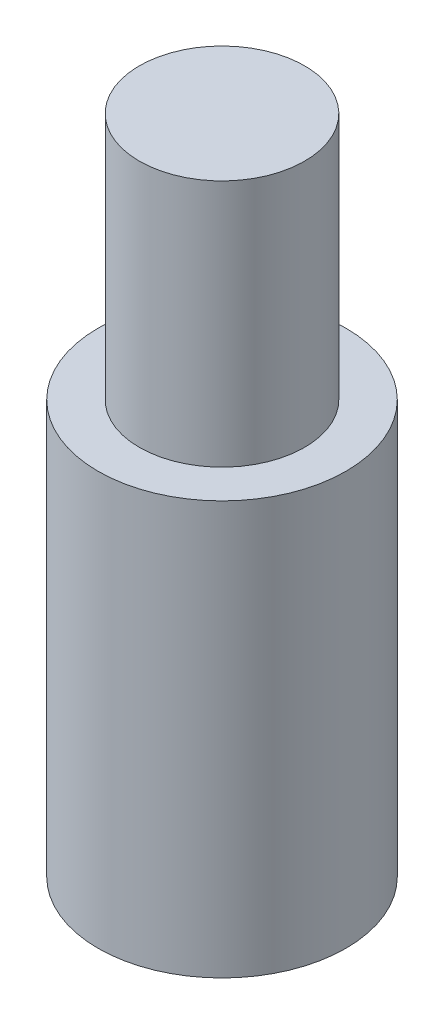
ISO-10303-21;
HEADER;
FILE_DESCRIPTION(('STEP AP214'),'2;1');
FILE_NAME('part.step','',(''),(''),'','','');
FILE_SCHEMA(('AUTOMOTIVE_DESIGN { 1 0 10303 214 1 1 1 1 }'));
ENDSEC;
DATA;
#1=APPLICATION_CONTEXT('core data for automotive mechanical design processes');
#2=APPLICATION_PROTOCOL_DEFINITION('international standard','automotive_design',2000,#1);
#3=PRODUCT_CONTEXT('',#1,'mechanical');
#4=PRODUCT('Part','Part','',(#3));
#5=PRODUCT_RELATED_PRODUCT_CATEGORY('part','',(#4));
#6=PRODUCT_DEFINITION_FORMATION('','',#4);
#7=PRODUCT_DEFINITION_CONTEXT('part definition',#1,'design');
#8=PRODUCT_DEFINITION('design','',#6,#7);
#9=PRODUCT_DEFINITION_SHAPE('','',#8);
#10=(LENGTH_UNIT() NAMED_UNIT(*) SI_UNIT(.MILLI.,.METRE.));
#11=(NAMED_UNIT(*) PLANE_ANGLE_UNIT() SI_UNIT($,.RADIAN.));
#12=(NAMED_UNIT(*) SI_UNIT($,.STERADIAN.) SOLID_ANGLE_UNIT());
#13=UNCERTAINTY_MEASURE_WITH_UNIT(LENGTH_MEASURE(1.E-05),#10,'distance_accuracy_value','');
#14=(GEOMETRIC_REPRESENTATION_CONTEXT(3) GLOBAL_UNCERTAINTY_ASSIGNED_CONTEXT((#13)) GLOBAL_UNIT_ASSIGNED_CONTEXT((#10,
#11,#12)) REPRESENTATION_CONTEXT('',''));
#15=CARTESIAN_POINT('',(0.,0.,0.));
#16=DIRECTION('',(0.,0.,1.));
#17=DIRECTION('',(1.,0.,0.));
#18=AXIS2_PLACEMENT_3D('',#15,#16,#17);
#19=CARTESIAN_POINT('',(0.,50.,0.));
#20=DIRECTION('',(0.,-1.,0.));
#21=DIRECTION('',(0.,0.,-1.));
#22=AXIS2_PLACEMENT_3D('',#19,#20,#21);
#23=CYLINDRICAL_SURFACE('',#22,15.);
#24=CARTESIAN_POINT('',(0.,50.,0.));
#25=DIRECTION('',(0.,1.,0.));
#26=DIRECTION('',(0.,0.,1.));
#27=AXIS2_PLACEMENT_3D('',#24,#25,#26);
#28=CIRCLE('',#27,15.);
#29=CARTESIAN_POINT('',(0.,50.,15.));
#30=VERTEX_POINT('',#29);
#31=EDGE_CURVE('E59',#30,#30,#28,.T.);
#32=ORIENTED_EDGE('',*,*,#31,.F.);
#33=EDGE_LOOP('',(#32));
#34=FACE_BOUND('',#33,.T.);
#35=CARTESIAN_POINT('',(0.,0.,0.));
#36=DIRECTION('',(0.,1.,0.));
#37=DIRECTION('',(0.,0.,1.));
#38=AXIS2_PLACEMENT_3D('',#35,#36,#37);
#39=CIRCLE('',#38,15.);
#40=CARTESIAN_POINT('',(0.,0.,15.));
#41=VERTEX_POINT('',#40);
#42=EDGE_CURVE('E53',#41,#41,#39,.T.);
#43=ORIENTED_EDGE('',*,*,#42,.T.);
#44=EDGE_LOOP('',(#43));
#45=FACE_BOUND('',#44,.T.);
#46=ADVANCED_FACE('F50',(#34,#45),#23,.T.);
#47=CARTESIAN_POINT('',(0.,50.,0.));
#48=DIRECTION('',(0.,1.,0.));
#49=DIRECTION('',(0.,0.,1.));
#50=AXIS2_PLACEMENT_3D('',#47,#48,#49);
#51=PLANE('',#50);
#52=CARTESIAN_POINT('',(0.,50.,0.));
#53=DIRECTION('',(0.,1.,0.));
#54=DIRECTION('',(0.,0.,1.));
#55=AXIS2_PLACEMENT_3D('',#52,#53,#54);
#56=CIRCLE('',#55,10.);
#57=CARTESIAN_POINT('',(0.,50.,10.));
#58=VERTEX_POINT('',#57);
#59=EDGE_CURVE('E11',#58,#58,#56,.T.);
#60=ORIENTED_EDGE('',*,*,#59,.F.);
#61=EDGE_LOOP('',(#60));
#62=FACE_BOUND('',#61,.T.);
#63=ORIENTED_EDGE('',*,*,#31,.T.);
#64=EDGE_LOOP('',(#63));
#65=FACE_BOUND('',#64,.T.);
#66=ADVANCED_FACE('F79',(#62,#65),#51,.T.);
#67=CARTESIAN_POINT('',(0.,0.,0.));
#68=DIRECTION('',(0.,1.,0.));
#69=DIRECTION('',(0.,0.,1.));
#70=AXIS2_PLACEMENT_3D('',#67,#68,#69);
#71=PLANE('',#70);
#72=ORIENTED_EDGE('',*,*,#42,.F.);
#73=EDGE_LOOP('',(#72));
#74=FACE_BOUND('',#73,.T.);
#75=ADVANCED_FACE('F76',(#74),#71,.F.);
#76=CARTESIAN_POINT('',(0.,80.,0.));
#77=DIRECTION('',(0.,-1.,0.));
#78=DIRECTION('',(0.,0.,-1.));
#79=AXIS2_PLACEMENT_3D('',#76,#77,#78);
#80=CYLINDRICAL_SURFACE('',#79,10.);
#81=CARTESIAN_POINT('',(0.,80.,0.));
#82=DIRECTION('',(0.,1.,0.));
#83=DIRECTION('',(0.,0.,1.));
#84=AXIS2_PLACEMENT_3D('',#81,#82,#83);
#85=CIRCLE('',#84,10.);
#86=CARTESIAN_POINT('',(0.,80.,10.));
#87=VERTEX_POINT('',#86);
#88=EDGE_CURVE('E65',#87,#87,#85,.T.);
#89=ORIENTED_EDGE('',*,*,#88,.F.);
#90=EDGE_LOOP('',(#89));
#91=FACE_BOUND('',#90,.T.);
#92=ORIENTED_EDGE('',*,*,#59,.T.);
#93=EDGE_LOOP('',(#92));
#94=FACE_BOUND('',#93,.T.);
#95=ADVANCED_FACE('F78',(#91,#94),#80,.T.);
#96=CARTESIAN_POINT('',(0.,80.,0.));
#97=DIRECTION('',(0.,1.,0.));
#98=DIRECTION('',(0.,0.,1.));
#99=AXIS2_PLACEMENT_3D('',#96,#97,#98);
#100=PLANE('',#99);
#101=ORIENTED_EDGE('',*,*,#88,.T.);
#102=EDGE_LOOP('',(#101));
#103=FACE_BOUND('',#102,.T.);
#104=ADVANCED_FACE('F84',(#103),#100,.T.);
#105=CLOSED_SHELL('',(#46,#66,#75,#95,#104));
#106=MANIFOLD_SOLID_BREP('B2',#105);
#107=ADVANCED_BREP_SHAPE_REPRESENTATION('',(#18,#106),#14);
#108=SHAPE_DEFINITION_REPRESENTATION(#9,#107);
ENDSEC;
END-ISO-10303-21;
